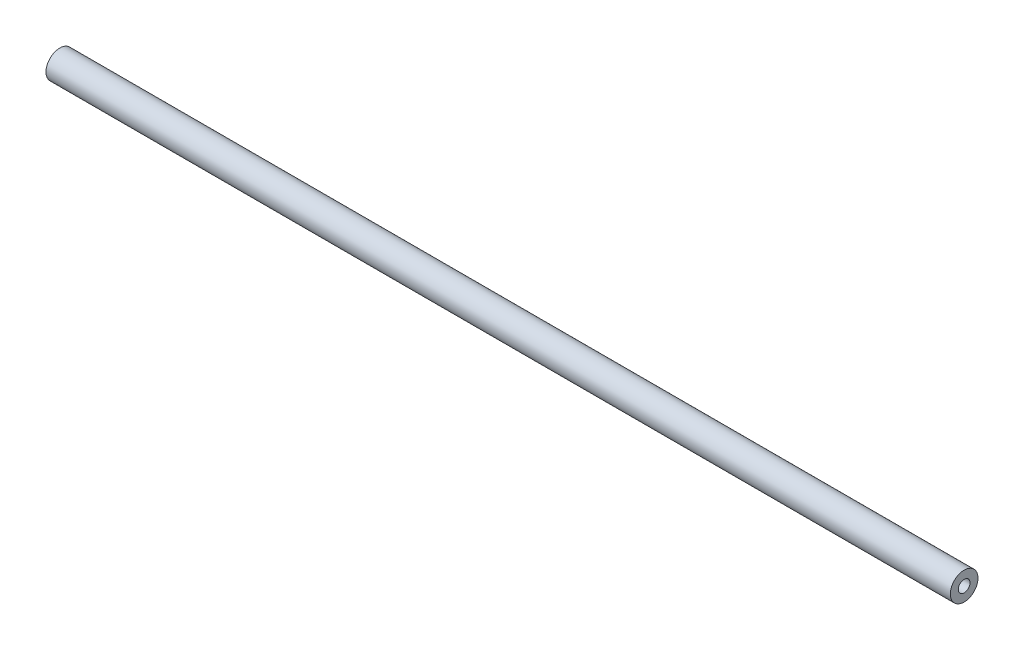
ISO-10303-21;
HEADER;
FILE_DESCRIPTION(('STEP AP214'),'2;1');
FILE_NAME('part.step','',(''),(''),'','','');
FILE_SCHEMA(('AUTOMOTIVE_DESIGN { 1 0 10303 214 1 1 1 1 }'));
ENDSEC;
DATA;
#1=APPLICATION_CONTEXT('core data for automotive mechanical design processes');
#2=APPLICATION_PROTOCOL_DEFINITION('international standard','automotive_design',2000,#1);
#3=PRODUCT_CONTEXT('',#1,'mechanical');
#4=PRODUCT('Part','Part','',(#3));
#5=PRODUCT_RELATED_PRODUCT_CATEGORY('part','',(#4));
#6=PRODUCT_DEFINITION_FORMATION('','',#4);
#7=PRODUCT_DEFINITION_CONTEXT('part definition',#1,'design');
#8=PRODUCT_DEFINITION('design','',#6,#7);
#9=PRODUCT_DEFINITION_SHAPE('','',#8);
#10=(LENGTH_UNIT() NAMED_UNIT(*) SI_UNIT(.MILLI.,.METRE.));
#11=(NAMED_UNIT(*) PLANE_ANGLE_UNIT() SI_UNIT($,.RADIAN.));
#12=(NAMED_UNIT(*) SI_UNIT($,.STERADIAN.) SOLID_ANGLE_UNIT());
#13=UNCERTAINTY_MEASURE_WITH_UNIT(LENGTH_MEASURE(1.E-05),#10,'distance_accuracy_value','');
#14=(GEOMETRIC_REPRESENTATION_CONTEXT(3) GLOBAL_UNCERTAINTY_ASSIGNED_CONTEXT((#13)) GLOBAL_UNIT_ASSIGNED_CONTEXT((#10,
#11,#12)) REPRESENTATION_CONTEXT('',''));
#15=CARTESIAN_POINT('',(0.,0.,0.));
#16=DIRECTION('',(0.,0.,1.));
#17=DIRECTION('',(1.,0.,0.));
#18=AXIS2_PLACEMENT_3D('',#15,#16,#17);
#19=CARTESIAN_POINT('',(155.575,0.,0.));
#20=DIRECTION('',(-1.,0.,0.));
#21=DIRECTION('',(0.,0.,1.));
#22=AXIS2_PLACEMENT_3D('',#19,#20,#21);
#23=CYLINDRICAL_SURFACE('',#22,4.7625);
#24=CARTESIAN_POINT('',(155.575,0.,0.));
#25=DIRECTION('',(1.,0.,0.));
#26=DIRECTION('',(0.,0.,-1.));
#27=AXIS2_PLACEMENT_3D('',#24,#25,#26);
#28=CIRCLE('',#27,4.7625);
#29=CARTESIAN_POINT('',(155.575,0.,-4.7625));
#30=VERTEX_POINT('',#29);
#31=EDGE_CURVE('E11',#30,#30,#28,.T.);
#32=ORIENTED_EDGE('',*,*,#31,.F.);
#33=EDGE_LOOP('',(#32));
#34=FACE_BOUND('',#33,.T.);
#35=CARTESIAN_POINT('',(-155.575,0.,0.));
#36=DIRECTION('',(1.,0.,0.));
#37=DIRECTION('',(0.,0.,-1.));
#38=AXIS2_PLACEMENT_3D('',#35,#36,#37);
#39=CIRCLE('',#38,4.7625);
#40=CARTESIAN_POINT('',(-155.575,0.,-4.7625));
#41=VERTEX_POINT('',#40);
#42=EDGE_CURVE('E48',#41,#41,#39,.T.);
#43=ORIENTED_EDGE('',*,*,#42,.T.);
#44=EDGE_LOOP('',(#43));
#45=FACE_BOUND('',#44,.T.);
#46=ADVANCED_FACE('F45',(#34,#45),#23,.T.);
#47=CARTESIAN_POINT('',(155.575,0.,0.));
#48=DIRECTION('',(1.,0.,0.));
#49=DIRECTION('',(0.,0.,-1.));
#50=AXIS2_PLACEMENT_3D('',#47,#48,#49);
#51=PLANE('',#50);
#52=CARTESIAN_POINT('',(155.575,0.,0.));
#53=DIRECTION('',(1.,0.,0.));
#54=DIRECTION('',(0.,0.,-1.));
#55=AXIS2_PLACEMENT_3D('',#52,#53,#54);
#56=CIRCLE('',#55,2.01929999999999);
#57=CARTESIAN_POINT('',(155.575,0.,-2.01929999999999));
#58=VERTEX_POINT('',#57);
#59=EDGE_CURVE('E69',#58,#58,#56,.T.);
#60=ORIENTED_EDGE('',*,*,#59,.F.);
#61=EDGE_LOOP('',(#60));
#62=FACE_BOUND('',#61,.T.);
#63=ORIENTED_EDGE('',*,*,#31,.T.);
#64=EDGE_LOOP('',(#63));
#65=FACE_BOUND('',#64,.T.);
#66=ADVANCED_FACE('F87',(#62,#65),#51,.T.);
#67=CARTESIAN_POINT('',(-155.575,0.,0.));
#68=DIRECTION('',(1.,0.,0.));
#69=DIRECTION('',(0.,0.,-1.));
#70=AXIS2_PLACEMENT_3D('',#67,#68,#69);
#71=PLANE('',#70);
#72=CARTESIAN_POINT('',(-155.575,0.,0.));
#73=DIRECTION('',(-1.,0.,0.));
#74=DIRECTION('',(0.,0.,1.));
#75=AXIS2_PLACEMENT_3D('',#72,#73,#74);
#76=CIRCLE('',#75,2.01929999999999);
#77=CARTESIAN_POINT('',(-155.575,0.,2.01929999999999));
#78=VERTEX_POINT('',#77);
#79=EDGE_CURVE('E68',#78,#78,#76,.T.);
#80=ORIENTED_EDGE('',*,*,#79,.F.);
#81=EDGE_LOOP('',(#80));
#82=FACE_BOUND('',#81,.T.);
#83=ORIENTED_EDGE('',*,*,#42,.F.);
#84=EDGE_LOOP('',(#83));
#85=FACE_BOUND('',#84,.T.);
#86=ADVANCED_FACE('F84',(#82,#85),#71,.F.);
#87=CARTESIAN_POINT('',(-143.54556,0.,0.));
#88=DIRECTION('',(-1.,0.,0.));
#89=DIRECTION('',(0.,0.,1.));
#90=AXIS2_PLACEMENT_3D('',#87,#88,#89);
#91=CONICAL_SURFACE('',#90,2.0193,1.02974425867665);
#92=CARTESIAN_POINT('',(-142.332242151998,0.,0.));
#93=VERTEX_POINT('',#92);
#94=VERTEX_LOOP('',#93);
#95=FACE_BOUND('',#94,.T.);
#96=CARTESIAN_POINT('',(-143.54556,0.,0.));
#97=DIRECTION('',(-1.,0.,0.));
#98=DIRECTION('',(0.,0.,1.));
#99=AXIS2_PLACEMENT_3D('',#96,#97,#98);
#100=CIRCLE('',#99,2.0193);
#101=CARTESIAN_POINT('',(-143.54556,0.,2.0193));
#102=VERTEX_POINT('',#101);
#103=EDGE_CURVE('E72',#102,#102,#100,.T.);
#104=ORIENTED_EDGE('',*,*,#103,.T.);
#105=EDGE_LOOP('',(#104));
#106=FACE_BOUND('',#105,.T.);
#107=ADVANCED_FACE('F86',(#95,#106),#91,.F.);
#108=CARTESIAN_POINT('',(-155.575,0.,0.));
#109=DIRECTION('',(-1.,0.,0.));
#110=DIRECTION('',(0.,0.,1.));
#111=AXIS2_PLACEMENT_3D('',#108,#109,#110);
#112=CYLINDRICAL_SURFACE('',#111,2.01929999999999);
#113=ORIENTED_EDGE('',*,*,#103,.F.);
#114=EDGE_LOOP('',(#113));
#115=FACE_BOUND('',#114,.T.);
#116=ORIENTED_EDGE('',*,*,#79,.T.);
#117=EDGE_LOOP('',(#116));
#118=FACE_BOUND('',#117,.T.);
#119=ADVANCED_FACE('F62',(#115,#118),#112,.F.);
#120=CARTESIAN_POINT('',(143.54556,0.,0.));
#121=DIRECTION('',(1.,0.,0.));
#122=DIRECTION('',(0.,0.,-1.));
#123=AXIS2_PLACEMENT_3D('',#120,#121,#122);
#124=CONICAL_SURFACE('',#123,2.0193,1.02974425867665);
#125=CARTESIAN_POINT('',(142.332242151998,0.,0.));
#126=VERTEX_POINT('',#125);
#127=VERTEX_LOOP('',#126);
#128=FACE_BOUND('',#127,.T.);
#129=CARTESIAN_POINT('',(143.54556,0.,0.));
#130=DIRECTION('',(1.,0.,0.));
#131=DIRECTION('',(0.,0.,-1.));
#132=AXIS2_PLACEMENT_3D('',#129,#130,#131);
#133=CIRCLE('',#132,2.0193);
#134=CARTESIAN_POINT('',(143.54556,0.,-2.0193));
#135=VERTEX_POINT('',#134);
#136=EDGE_CURVE('E66',#135,#135,#133,.T.);
#137=ORIENTED_EDGE('',*,*,#136,.T.);
#138=EDGE_LOOP('',(#137));
#139=FACE_BOUND('',#138,.T.);
#140=ADVANCED_FACE('F58',(#128,#139),#124,.F.);
#141=CARTESIAN_POINT('',(155.575,0.,0.));
#142=DIRECTION('',(1.,0.,0.));
#143=DIRECTION('',(0.,0.,-1.));
#144=AXIS2_PLACEMENT_3D('',#141,#142,#143);
#145=CYLINDRICAL_SURFACE('',#144,2.01929999999999);
#146=ORIENTED_EDGE('',*,*,#136,.F.);
#147=EDGE_LOOP('',(#146));
#148=FACE_BOUND('',#147,.T.);
#149=ORIENTED_EDGE('',*,*,#59,.T.);
#150=EDGE_LOOP('',(#149));
#151=FACE_BOUND('',#150,.T.);
#152=ADVANCED_FACE('F61',(#148,#151),#145,.F.);
#153=CLOSED_SHELL('',(#46,#66,#86,#107,#119,#140,#152));
#154=MANIFOLD_SOLID_BREP('B2',#153);
#155=ADVANCED_BREP_SHAPE_REPRESENTATION('',(#18,#154),#14);
#156=SHAPE_DEFINITION_REPRESENTATION(#9,#155);
ENDSEC;
END-ISO-10303-21;
